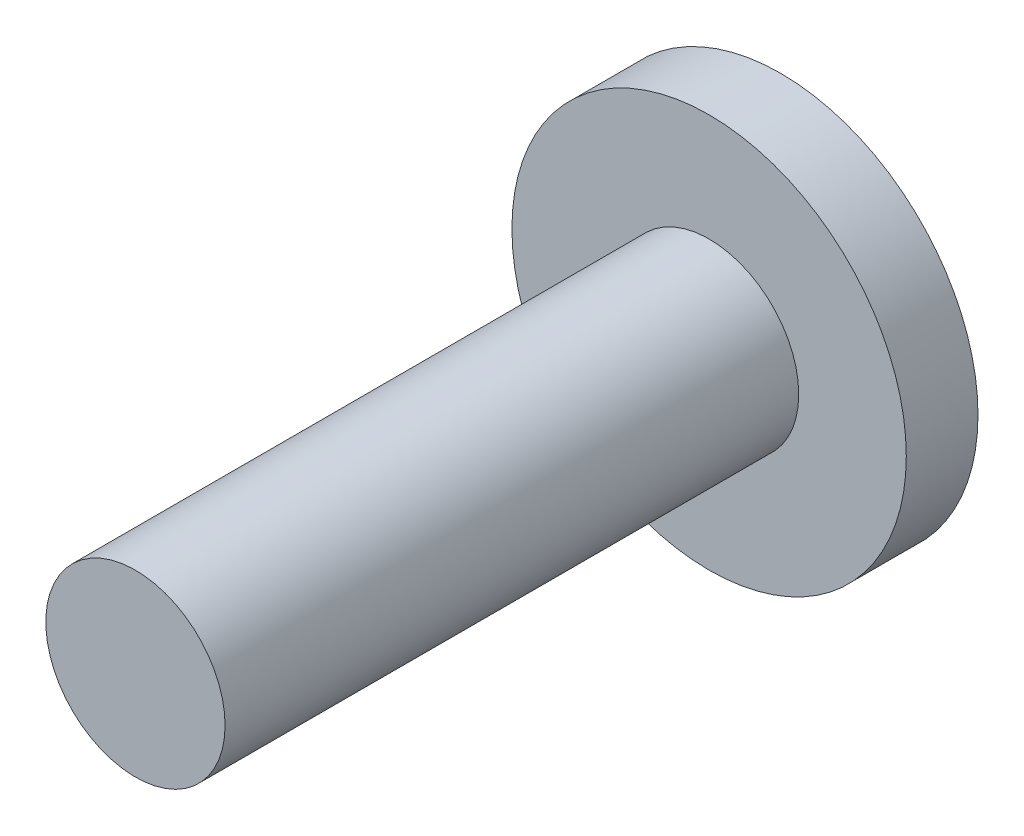
ISO-10303-21;
HEADER;
FILE_DESCRIPTION(('STEP AP214'),'2;1');
FILE_NAME('part.step','',(''),(''),'','','');
FILE_SCHEMA(('AUTOMOTIVE_DESIGN { 1 0 10303 214 1 1 1 1 }'));
ENDSEC;
DATA;
#1=APPLICATION_CONTEXT('core data for automotive mechanical design processes');
#2=APPLICATION_PROTOCOL_DEFINITION('international standard','automotive_design',2000,#1);
#3=PRODUCT_CONTEXT('',#1,'mechanical');
#4=PRODUCT('Part','Part','',(#3));
#5=PRODUCT_RELATED_PRODUCT_CATEGORY('part','',(#4));
#6=PRODUCT_DEFINITION_FORMATION('','',#4);
#7=PRODUCT_DEFINITION_CONTEXT('part definition',#1,'design');
#8=PRODUCT_DEFINITION('design','',#6,#7);
#9=PRODUCT_DEFINITION_SHAPE('','',#8);
#10=(LENGTH_UNIT() NAMED_UNIT(*) SI_UNIT(.MILLI.,.METRE.));
#11=(NAMED_UNIT(*) PLANE_ANGLE_UNIT() SI_UNIT($,.RADIAN.));
#12=(NAMED_UNIT(*) SI_UNIT($,.STERADIAN.) SOLID_ANGLE_UNIT());
#13=UNCERTAINTY_MEASURE_WITH_UNIT(LENGTH_MEASURE(1.E-05),#10,'distance_accuracy_value','');
#14=(GEOMETRIC_REPRESENTATION_CONTEXT(3) GLOBAL_UNCERTAINTY_ASSIGNED_CONTEXT((#13)) GLOBAL_UNIT_ASSIGNED_CONTEXT((#10,
#11,#12)) REPRESENTATION_CONTEXT('',''));
#15=CARTESIAN_POINT('',(0.,0.,0.));
#16=DIRECTION('',(0.,0.,1.));
#17=DIRECTION('',(1.,0.,0.));
#18=AXIS2_PLACEMENT_3D('',#15,#16,#17);
#19=CARTESIAN_POINT('',(0.,0.,1.));
#20=DIRECTION('',(0.,0.,-1.));
#21=DIRECTION('',(-1.,0.,0.));
#22=AXIS2_PLACEMENT_3D('',#19,#20,#21);
#23=CYLINDRICAL_SURFACE('',#22,2.75);
#24=CARTESIAN_POINT('',(0.,0.,1.));
#25=DIRECTION('',(0.,0.,1.));
#26=DIRECTION('',(1.,0.,0.));
#27=AXIS2_PLACEMENT_3D('',#24,#25,#26);
#28=CIRCLE('',#27,2.75);
#29=CARTESIAN_POINT('',(2.75,0.,1.));
#30=VERTEX_POINT('',#29);
#31=EDGE_CURVE('E25',#30,#30,#28,.T.);
#32=ORIENTED_EDGE('',*,*,#31,.F.);
#33=EDGE_LOOP('',(#32));
#34=FACE_BOUND('',#33,.T.);
#35=CARTESIAN_POINT('',(0.,0.,0.));
#36=DIRECTION('',(0.,0.,1.));
#37=DIRECTION('',(1.,0.,0.));
#38=AXIS2_PLACEMENT_3D('',#35,#36,#37);
#39=CIRCLE('',#38,2.75);
#40=CARTESIAN_POINT('',(2.75,0.,0.));
#41=VERTEX_POINT('',#40);
#42=EDGE_CURVE('E20',#41,#41,#39,.T.);
#43=ORIENTED_EDGE('',*,*,#42,.T.);
#44=EDGE_LOOP('',(#43));
#45=FACE_BOUND('',#44,.T.);
#46=ADVANCED_FACE('F17',(#34,#45),#23,.T.);
#47=CARTESIAN_POINT('',(0.,0.,1.));
#48=DIRECTION('',(0.,0.,1.));
#49=DIRECTION('',(1.,0.,0.));
#50=AXIS2_PLACEMENT_3D('',#47,#48,#49);
#51=PLANE('',#50);
#52=CARTESIAN_POINT('',(0.,0.,1.));
#53=DIRECTION('',(0.,0.,1.));
#54=DIRECTION('',(1.,0.,0.));
#55=AXIS2_PLACEMENT_3D('',#52,#53,#54);
#56=CIRCLE('',#55,1.25);
#57=CARTESIAN_POINT('',(1.25,0.,1.));
#58=VERTEX_POINT('',#57);
#59=EDGE_CURVE('E11',#58,#58,#56,.T.);
#60=ORIENTED_EDGE('',*,*,#59,.F.);
#61=EDGE_LOOP('',(#60));
#62=FACE_BOUND('',#61,.T.);
#63=ORIENTED_EDGE('',*,*,#31,.T.);
#64=EDGE_LOOP('',(#63));
#65=FACE_BOUND('',#64,.T.);
#66=ADVANCED_FACE('F203',(#62,#65),#51,.T.);
#67=CARTESIAN_POINT('',(0.,0.,0.));
#68=DIRECTION('',(0.,0.,1.));
#69=DIRECTION('',(1.,0.,0.));
#70=AXIS2_PLACEMENT_3D('',#67,#68,#69);
#71=PLANE('',#70);
#72=DIRECTION('',(1.,0.,0.));
#73=VECTOR('',#72,1.);
#74=CARTESIAN_POINT('',(0.25,0.25,0.));
#75=LINE('',#74,#73);
#76=CARTESIAN_POINT('',(0.25,0.25,0.));
#77=VERTEX_POINT('',#76);
#78=CARTESIAN_POINT('',(2.25,0.25,0.));
#79=VERTEX_POINT('',#78);
#80=EDGE_CURVE('E143',#77,#79,#75,.T.);
#81=ORIENTED_EDGE('',*,*,#80,.F.);
#82=DIRECTION('',(0.,-1.,0.));
#83=VECTOR('',#82,1.);
#84=CARTESIAN_POINT('',(0.25,0.25,0.));
#85=LINE('',#84,#83);
#86=CARTESIAN_POINT('',(0.25,2.25,0.));
#87=VERTEX_POINT('',#86);
#88=EDGE_CURVE('E33',#87,#77,#85,.T.);
#89=ORIENTED_EDGE('',*,*,#88,.F.);
#90=DIRECTION('',(1.,0.,0.));
#91=VECTOR('',#90,1.);
#92=CARTESIAN_POINT('',(-0.25,2.25,0.));
#93=LINE('',#92,#91);
#94=CARTESIAN_POINT('',(-0.25,2.25,0.));
#95=VERTEX_POINT('',#94);
#96=EDGE_CURVE('E170',#95,#87,#93,.T.);
#97=ORIENTED_EDGE('',*,*,#96,.F.);
#98=DIRECTION('',(0.,1.,0.));
#99=VECTOR('',#98,1.);
#100=CARTESIAN_POINT('',(-0.25,0.25,0.));
#101=LINE('',#100,#99);
#102=CARTESIAN_POINT('',(-0.25,0.25,0.));
#103=VERTEX_POINT('',#102);
#104=EDGE_CURVE('E168',#103,#95,#101,.T.);
#105=ORIENTED_EDGE('',*,*,#104,.F.);
#106=DIRECTION('',(1.,0.,0.));
#107=VECTOR('',#106,1.);
#108=CARTESIAN_POINT('',(-2.25,0.25,0.));
#109=LINE('',#108,#107);
#110=CARTESIAN_POINT('',(-2.25,0.25,0.));
#111=VERTEX_POINT('',#110);
#112=EDGE_CURVE('E117',#111,#103,#109,.T.);
#113=ORIENTED_EDGE('',*,*,#112,.F.);
#114=DIRECTION('',(0.,1.,0.));
#115=VECTOR('',#114,1.);
#116=CARTESIAN_POINT('',(-2.25,0.25,0.));
#117=LINE('',#116,#115);
#118=CARTESIAN_POINT('',(-2.25,-0.25,0.));
#119=VERTEX_POINT('',#118);
#120=EDGE_CURVE('E164',#119,#111,#117,.T.);
#121=ORIENTED_EDGE('',*,*,#120,.F.);
#122=DIRECTION('',(-1.,0.,0.));
#123=VECTOR('',#122,1.);
#124=CARTESIAN_POINT('',(-2.25,-0.25,0.));
#125=LINE('',#124,#123);
#126=CARTESIAN_POINT('',(-0.25,-0.25,0.));
#127=VERTEX_POINT('',#126);
#128=EDGE_CURVE('E161',#127,#119,#125,.T.);
#129=ORIENTED_EDGE('',*,*,#128,.F.);
#130=DIRECTION('',(0.,1.,0.));
#131=VECTOR('',#130,1.);
#132=CARTESIAN_POINT('',(-0.25,-2.25,0.));
#133=LINE('',#132,#131);
#134=CARTESIAN_POINT('',(-0.25,-2.25,0.));
#135=VERTEX_POINT('',#134);
#136=EDGE_CURVE('E158',#135,#127,#133,.T.);
#137=ORIENTED_EDGE('',*,*,#136,.F.);
#138=DIRECTION('',(-1.,0.,0.));
#139=VECTOR('',#138,1.);
#140=CARTESIAN_POINT('',(-0.25,-2.25,0.));
#141=LINE('',#140,#139);
#142=CARTESIAN_POINT('',(0.25,-2.25,0.));
#143=VERTEX_POINT('',#142);
#144=EDGE_CURVE('E155',#143,#135,#141,.T.);
#145=ORIENTED_EDGE('',*,*,#144,.F.);
#146=DIRECTION('',(0.,-1.,0.));
#147=VECTOR('',#146,1.);
#148=CARTESIAN_POINT('',(0.25,-2.25,0.));
#149=LINE('',#148,#147);
#150=CARTESIAN_POINT('',(0.25,-0.25,0.));
#151=VERTEX_POINT('',#150);
#152=EDGE_CURVE('E152',#151,#143,#149,.T.);
#153=ORIENTED_EDGE('',*,*,#152,.F.);
#154=DIRECTION('',(-1.,0.,0.));
#155=VECTOR('',#154,1.);
#156=CARTESIAN_POINT('',(0.25,-0.25,0.));
#157=LINE('',#156,#155);
#158=CARTESIAN_POINT('',(2.25,-0.25,0.));
#159=VERTEX_POINT('',#158);
#160=EDGE_CURVE('E149',#159,#151,#157,.T.);
#161=ORIENTED_EDGE('',*,*,#160,.F.);
#162=DIRECTION('',(0.,-1.,0.));
#163=VECTOR('',#162,1.);
#164=CARTESIAN_POINT('',(2.25,0.25,0.));
#165=LINE('',#164,#163);
#166=EDGE_CURVE('E146',#79,#159,#165,.T.);
#167=ORIENTED_EDGE('',*,*,#166,.F.);
#168=EDGE_LOOP('',(#81,#89,#97,#105,#113,#121,#129,#137,#145,#153,#161,#167));
#169=FACE_BOUND('',#168,.T.);
#170=ORIENTED_EDGE('',*,*,#42,.F.);
#171=EDGE_LOOP('',(#170));
#172=FACE_BOUND('',#171,.T.);
#173=ADVANCED_FACE('F200',(#169,#172),#71,.F.);
#174=CARTESIAN_POINT('',(0.,0.,9.));
#175=DIRECTION('',(0.,0.,-1.));
#176=DIRECTION('',(-1.,0.,0.));
#177=AXIS2_PLACEMENT_3D('',#174,#175,#176);
#178=CYLINDRICAL_SURFACE('',#177,1.25);
#179=CARTESIAN_POINT('',(0.,0.,9.));
#180=DIRECTION('',(0.,0.,1.));
#181=DIRECTION('',(1.,0.,0.));
#182=AXIS2_PLACEMENT_3D('',#179,#180,#181);
#183=CIRCLE('',#182,1.25);
#184=CARTESIAN_POINT('',(1.25,0.,9.));
#185=VERTEX_POINT('',#184);
#186=EDGE_CURVE('E174',#185,#185,#183,.T.);
#187=ORIENTED_EDGE('',*,*,#186,.F.);
#188=EDGE_LOOP('',(#187));
#189=FACE_BOUND('',#188,.T.);
#190=ORIENTED_EDGE('',*,*,#59,.T.);
#191=EDGE_LOOP('',(#190));
#192=FACE_BOUND('',#191,.T.);
#193=ADVANCED_FACE('F202',(#189,#192),#178,.T.);
#194=CARTESIAN_POINT('',(0.,0.,9.));
#195=DIRECTION('',(0.,0.,1.));
#196=DIRECTION('',(1.,0.,0.));
#197=AXIS2_PLACEMENT_3D('',#194,#195,#196);
#198=PLANE('',#197);
#199=ORIENTED_EDGE('',*,*,#186,.T.);
#200=EDGE_LOOP('',(#199));
#201=FACE_BOUND('',#200,.T.);
#202=ADVANCED_FACE('F211',(#201),#198,.T.);
#203=CARTESIAN_POINT('',(0.25,0.25,0.5));
#204=DIRECTION('',(1.,0.,0.));
#205=DIRECTION('',(0.,0.,-1.));
#206=AXIS2_PLACEMENT_3D('',#203,#204,#205);
#207=PLANE('',#206);
#208=ORIENTED_EDGE('',*,*,#88,.T.);
#209=DIRECTION('',(0.,0.,-1.));
#210=VECTOR('',#209,1.);
#211=CARTESIAN_POINT('',(0.25,0.25,0.5));
#212=LINE('',#211,#210);
#213=CARTESIAN_POINT('',(0.25,0.25,0.5));
#214=VERTEX_POINT('',#213);
#215=EDGE_CURVE('E81',#214,#77,#212,.T.);
#216=ORIENTED_EDGE('',*,*,#215,.F.);
#217=DIRECTION('',(0.,-1.,0.));
#218=VECTOR('',#217,1.);
#219=CARTESIAN_POINT('',(0.25,0.25,0.5));
#220=LINE('',#219,#218);
#221=CARTESIAN_POINT('',(0.25,2.25,0.5));
#222=VERTEX_POINT('',#221);
#223=EDGE_CURVE('E172',#222,#214,#220,.T.);
#224=ORIENTED_EDGE('',*,*,#223,.F.);
#225=DIRECTION('',(0.,0.,-1.));
#226=VECTOR('',#225,1.);
#227=CARTESIAN_POINT('',(0.25,2.25,0.5));
#228=LINE('',#227,#226);
#229=EDGE_CURVE('E41',#222,#87,#228,.T.);
#230=ORIENTED_EDGE('',*,*,#229,.T.);
#231=EDGE_LOOP('',(#208,#216,#224,#230));
#232=FACE_BOUND('',#231,.T.);
#233=ADVANCED_FACE('F249',(#232),#207,.F.);
#234=CARTESIAN_POINT('',(-0.25,2.25,0.5));
#235=DIRECTION('',(0.,1.,0.));
#236=DIRECTION('',(0.,0.,1.));
#237=AXIS2_PLACEMENT_3D('',#234,#235,#236);
#238=PLANE('',#237);
#239=ORIENTED_EDGE('',*,*,#96,.T.);
#240=ORIENTED_EDGE('',*,*,#229,.F.);
#241=DIRECTION('',(1.,0.,0.));
#242=VECTOR('',#241,1.);
#243=CARTESIAN_POINT('',(-0.25,2.25,0.5));
#244=LINE('',#243,#242);
#245=CARTESIAN_POINT('',(-0.25,2.25,0.5));
#246=VERTEX_POINT('',#245);
#247=EDGE_CURVE('E129',#246,#222,#244,.T.);
#248=ORIENTED_EDGE('',*,*,#247,.F.);
#249=DIRECTION('',(0.,0.,-1.));
#250=VECTOR('',#249,1.);
#251=CARTESIAN_POINT('',(-0.25,2.25,0.5));
#252=LINE('',#251,#250);
#253=EDGE_CURVE('E121',#246,#95,#252,.T.);
#254=ORIENTED_EDGE('',*,*,#253,.T.);
#255=EDGE_LOOP('',(#239,#240,#248,#254));
#256=FACE_BOUND('',#255,.T.);
#257=ADVANCED_FACE('F259',(#256),#238,.F.);
#258=CARTESIAN_POINT('',(-0.25,0.25,0.5));
#259=DIRECTION('',(-1.,0.,0.));
#260=DIRECTION('',(0.,-1.,0.));
#261=AXIS2_PLACEMENT_3D('',#258,#259,#260);
#262=PLANE('',#261);
#263=ORIENTED_EDGE('',*,*,#104,.T.);
#264=ORIENTED_EDGE('',*,*,#253,.F.);
#265=DIRECTION('',(0.,1.,0.));
#266=VECTOR('',#265,1.);
#267=CARTESIAN_POINT('',(-0.25,0.25,0.5));
#268=LINE('',#267,#266);
#269=CARTESIAN_POINT('',(-0.25,0.25,0.5));
#270=VERTEX_POINT('',#269);
#271=EDGE_CURVE('E125',#270,#246,#268,.T.);
#272=ORIENTED_EDGE('',*,*,#271,.F.);
#273=DIRECTION('',(0.,0.,-1.));
#274=VECTOR('',#273,1.);
#275=CARTESIAN_POINT('',(-0.25,0.25,0.5));
#276=LINE('',#275,#274);
#277=EDGE_CURVE('E110',#270,#103,#276,.T.);
#278=ORIENTED_EDGE('',*,*,#277,.T.);
#279=EDGE_LOOP('',(#263,#264,#272,#278));
#280=FACE_BOUND('',#279,.T.);
#281=ADVANCED_FACE('F126',(#280),#262,.F.);
#282=CARTESIAN_POINT('',(-2.25,0.25,0.5));
#283=DIRECTION('',(0.,1.,0.));
#284=DIRECTION('',(-1.,0.,0.));
#285=AXIS2_PLACEMENT_3D('',#282,#283,#284);
#286=PLANE('',#285);
#287=ORIENTED_EDGE('',*,*,#112,.T.);
#288=ORIENTED_EDGE('',*,*,#277,.F.);
#289=DIRECTION('',(1.,0.,0.));
#290=VECTOR('',#289,1.);
#291=CARTESIAN_POINT('',(-2.25,0.25,0.5));
#292=LINE('',#291,#290);
#293=CARTESIAN_POINT('',(-2.25,0.25,0.5));
#294=VERTEX_POINT('',#293);
#295=EDGE_CURVE('E114',#294,#270,#292,.T.);
#296=ORIENTED_EDGE('',*,*,#295,.F.);
#297=DIRECTION('',(0.,0.,-1.));
#298=VECTOR('',#297,1.);
#299=CARTESIAN_POINT('',(-2.25,0.25,0.5));
#300=LINE('',#299,#298);
#301=EDGE_CURVE('E122',#294,#111,#300,.T.);
#302=ORIENTED_EDGE('',*,*,#301,.T.);
#303=EDGE_LOOP('',(#287,#288,#296,#302));
#304=FACE_BOUND('',#303,.T.);
#305=ADVANCED_FACE('F112',(#304),#286,.F.);
#306=CARTESIAN_POINT('',(-2.25,0.25,0.5));
#307=DIRECTION('',(-1.,0.,0.));
#308=DIRECTION('',(0.,0.,1.));
#309=AXIS2_PLACEMENT_3D('',#306,#307,#308);
#310=PLANE('',#309);
#311=ORIENTED_EDGE('',*,*,#120,.T.);
#312=ORIENTED_EDGE('',*,*,#301,.F.);
#313=DIRECTION('',(0.,1.,0.));
#314=VECTOR('',#313,1.);
#315=CARTESIAN_POINT('',(-2.25,0.25,0.5));
#316=LINE('',#315,#314);
#317=CARTESIAN_POINT('',(-2.25,-0.25,0.5));
#318=VERTEX_POINT('',#317);
#319=EDGE_CURVE('E135',#318,#294,#316,.T.);
#320=ORIENTED_EDGE('',*,*,#319,.F.);
#321=DIRECTION('',(0.,0.,-1.));
#322=VECTOR('',#321,1.);
#323=CARTESIAN_POINT('',(-2.25,-0.25,0.5));
#324=LINE('',#323,#322);
#325=EDGE_CURVE('E177',#318,#119,#324,.T.);
#326=ORIENTED_EDGE('',*,*,#325,.T.);
#327=EDGE_LOOP('',(#311,#312,#320,#326));
#328=FACE_BOUND('',#327,.T.);
#329=ADVANCED_FACE('F284',(#328),#310,.F.);
#330=CARTESIAN_POINT('',(-2.25,-0.25,0.5));
#331=DIRECTION('',(0.,-1.,0.));
#332=DIRECTION('',(1.,0.,0.));
#333=AXIS2_PLACEMENT_3D('',#330,#331,#332);
#334=PLANE('',#333);
#335=ORIENTED_EDGE('',*,*,#128,.T.);
#336=ORIENTED_EDGE('',*,*,#325,.F.);
#337=DIRECTION('',(-1.,0.,0.));
#338=VECTOR('',#337,1.);
#339=CARTESIAN_POINT('',(-2.25,-0.25,0.5));
#340=LINE('',#339,#338);
#341=CARTESIAN_POINT('',(-0.25,-0.25,0.5));
#342=VERTEX_POINT('',#341);
#343=EDGE_CURVE('E137',#342,#318,#340,.T.);
#344=ORIENTED_EDGE('',*,*,#343,.F.);
#345=DIRECTION('',(0.,0.,-1.));
#346=VECTOR('',#345,1.);
#347=CARTESIAN_POINT('',(-0.25,-0.25,0.5));
#348=LINE('',#347,#346);
#349=EDGE_CURVE('E179',#342,#127,#348,.T.);
#350=ORIENTED_EDGE('',*,*,#349,.T.);
#351=EDGE_LOOP('',(#335,#336,#344,#350));
#352=FACE_BOUND('',#351,.T.);
#353=ADVANCED_FACE('F293',(#352),#334,.F.);
#354=CARTESIAN_POINT('',(-0.25,-2.25,0.5));
#355=DIRECTION('',(-1.,0.,0.));
#356=DIRECTION('',(0.,-1.,0.));
#357=AXIS2_PLACEMENT_3D('',#354,#355,#356);
#358=PLANE('',#357);
#359=ORIENTED_EDGE('',*,*,#136,.T.);
#360=ORIENTED_EDGE('',*,*,#349,.F.);
#361=DIRECTION('',(0.,1.,0.));
#362=VECTOR('',#361,1.);
#363=CARTESIAN_POINT('',(-0.25,-2.25,0.5));
#364=LINE('',#363,#362);
#365=CARTESIAN_POINT('',(-0.25,-2.25,0.5));
#366=VERTEX_POINT('',#365);
#367=EDGE_CURVE('E399',#366,#342,#364,.T.);
#368=ORIENTED_EDGE('',*,*,#367,.F.);
#369=DIRECTION('',(0.,0.,-1.));
#370=VECTOR('',#369,1.);
#371=CARTESIAN_POINT('',(-0.25,-2.25,0.5));
#372=LINE('',#371,#370);
#373=EDGE_CURVE('E181',#366,#135,#372,.T.);
#374=ORIENTED_EDGE('',*,*,#373,.T.);
#375=EDGE_LOOP('',(#359,#360,#368,#374));
#376=FACE_BOUND('',#375,.T.);
#377=ADVANCED_FACE('F303',(#376),#358,.F.);
#378=CARTESIAN_POINT('',(-0.25,-2.25,0.5));
#379=DIRECTION('',(0.,-1.,0.));
#380=DIRECTION('',(0.,0.,-1.));
#381=AXIS2_PLACEMENT_3D('',#378,#379,#380);
#382=PLANE('',#381);
#383=ORIENTED_EDGE('',*,*,#144,.T.);
#384=ORIENTED_EDGE('',*,*,#373,.F.);
#385=DIRECTION('',(-1.,0.,0.));
#386=VECTOR('',#385,1.);
#387=CARTESIAN_POINT('',(-0.25,-2.25,0.5));
#388=LINE('',#387,#386);
#389=CARTESIAN_POINT('',(0.25,-2.25,0.5));
#390=VERTEX_POINT('',#389);
#391=EDGE_CURVE('E396',#390,#366,#388,.T.);
#392=ORIENTED_EDGE('',*,*,#391,.F.);
#393=DIRECTION('',(0.,0.,-1.));
#394=VECTOR('',#393,1.);
#395=CARTESIAN_POINT('',(0.25,-2.25,0.5));
#396=LINE('',#395,#394);
#397=EDGE_CURVE('E183',#390,#143,#396,.T.);
#398=ORIENTED_EDGE('',*,*,#397,.T.);
#399=EDGE_LOOP('',(#383,#384,#392,#398));
#400=FACE_BOUND('',#399,.T.);
#401=ADVANCED_FACE('F313',(#400),#382,.F.);
#402=CARTESIAN_POINT('',(0.25,-2.25,0.5));
#403=DIRECTION('',(1.,0.,0.));
#404=DIRECTION('',(0.,1.,0.));
#405=AXIS2_PLACEMENT_3D('',#402,#403,#404);
#406=PLANE('',#405);
#407=ORIENTED_EDGE('',*,*,#152,.T.);
#408=ORIENTED_EDGE('',*,*,#397,.F.);
#409=DIRECTION('',(0.,-1.,0.));
#410=VECTOR('',#409,1.);
#411=CARTESIAN_POINT('',(0.25,-2.25,0.5));
#412=LINE('',#411,#410);
#413=CARTESIAN_POINT('',(0.25,-0.25,0.5));
#414=VERTEX_POINT('',#413);
#415=EDGE_CURVE('E393',#414,#390,#412,.T.);
#416=ORIENTED_EDGE('',*,*,#415,.F.);
#417=DIRECTION('',(0.,0.,-1.));
#418=VECTOR('',#417,1.);
#419=CARTESIAN_POINT('',(0.25,-0.25,0.5));
#420=LINE('',#419,#418);
#421=EDGE_CURVE('E185',#414,#151,#420,.T.);
#422=ORIENTED_EDGE('',*,*,#421,.T.);
#423=EDGE_LOOP('',(#407,#408,#416,#422));
#424=FACE_BOUND('',#423,.T.);
#425=ADVANCED_FACE('F323',(#424),#406,.F.);
#426=CARTESIAN_POINT('',(0.25,-0.25,0.5));
#427=DIRECTION('',(0.,-1.,0.));
#428=DIRECTION('',(1.,0.,0.));
#429=AXIS2_PLACEMENT_3D('',#426,#427,#428);
#430=PLANE('',#429);
#431=ORIENTED_EDGE('',*,*,#160,.T.);
#432=ORIENTED_EDGE('',*,*,#421,.F.);
#433=DIRECTION('',(-1.,0.,0.));
#434=VECTOR('',#433,1.);
#435=CARTESIAN_POINT('',(0.25,-0.25,0.5));
#436=LINE('',#435,#434);
#437=CARTESIAN_POINT('',(2.25,-0.25,0.5));
#438=VERTEX_POINT('',#437);
#439=EDGE_CURVE('E386',#438,#414,#436,.T.);
#440=ORIENTED_EDGE('',*,*,#439,.F.);
#441=DIRECTION('',(0.,0.,-1.));
#442=VECTOR('',#441,1.);
#443=CARTESIAN_POINT('',(2.25,-0.25,0.5));
#444=LINE('',#443,#442);
#445=EDGE_CURVE('E187',#438,#159,#444,.T.);
#446=ORIENTED_EDGE('',*,*,#445,.T.);
#447=EDGE_LOOP('',(#431,#432,#440,#446));
#448=FACE_BOUND('',#447,.T.);
#449=ADVANCED_FACE('F333',(#448),#430,.F.);
#450=CARTESIAN_POINT('',(2.25,0.25,0.5));
#451=DIRECTION('',(1.,0.,0.));
#452=DIRECTION('',(0.,0.,-1.));
#453=AXIS2_PLACEMENT_3D('',#450,#451,#452);
#454=PLANE('',#453);
#455=ORIENTED_EDGE('',*,*,#166,.T.);
#456=ORIENTED_EDGE('',*,*,#445,.F.);
#457=DIRECTION('',(0.,-1.,0.));
#458=VECTOR('',#457,1.);
#459=CARTESIAN_POINT('',(2.25,0.25,0.5));
#460=LINE('',#459,#458);
#461=CARTESIAN_POINT('',(2.25,0.25,0.5));
#462=VERTEX_POINT('',#461);
#463=EDGE_CURVE('E383',#462,#438,#460,.T.);
#464=ORIENTED_EDGE('',*,*,#463,.F.);
#465=DIRECTION('',(0.,0.,-1.));
#466=VECTOR('',#465,1.);
#467=CARTESIAN_POINT('',(2.25,0.25,0.5));
#468=LINE('',#467,#466);
#469=EDGE_CURVE('E189',#462,#79,#468,.T.);
#470=ORIENTED_EDGE('',*,*,#469,.T.);
#471=EDGE_LOOP('',(#455,#456,#464,#470));
#472=FACE_BOUND('',#471,.T.);
#473=ADVANCED_FACE('F343',(#472),#454,.F.);
#474=CARTESIAN_POINT('',(0.25,0.25,0.5));
#475=DIRECTION('',(0.,1.,0.));
#476=DIRECTION('',(-1.,0.,0.));
#477=AXIS2_PLACEMENT_3D('',#474,#475,#476);
#478=PLANE('',#477);
#479=ORIENTED_EDGE('',*,*,#80,.T.);
#480=ORIENTED_EDGE('',*,*,#469,.F.);
#481=DIRECTION('',(1.,0.,0.));
#482=VECTOR('',#481,1.);
#483=CARTESIAN_POINT('',(0.25,0.25,0.5));
#484=LINE('',#483,#482);
#485=EDGE_CURVE('E387',#214,#462,#484,.T.);
#486=ORIENTED_EDGE('',*,*,#485,.F.);
#487=ORIENTED_EDGE('',*,*,#215,.T.);
#488=EDGE_LOOP('',(#479,#480,#486,#487));
#489=FACE_BOUND('',#488,.T.);
#490=ADVANCED_FACE('F353',(#489),#478,.F.);
#491=CARTESIAN_POINT('',(0.,0.,0.5));
#492=DIRECTION('',(0.,0.,-1.));
#493=DIRECTION('',(-1.,0.,0.));
#494=AXIS2_PLACEMENT_3D('',#491,#492,#493);
#495=PLANE('',#494);
#496=ORIENTED_EDGE('',*,*,#223,.T.);
#497=ORIENTED_EDGE('',*,*,#485,.T.);
#498=ORIENTED_EDGE('',*,*,#463,.T.);
#499=ORIENTED_EDGE('',*,*,#439,.T.);
#500=ORIENTED_EDGE('',*,*,#415,.T.);
#501=ORIENTED_EDGE('',*,*,#391,.T.);
#502=ORIENTED_EDGE('',*,*,#367,.T.);
#503=ORIENTED_EDGE('',*,*,#343,.T.);
#504=ORIENTED_EDGE('',*,*,#319,.T.);
#505=ORIENTED_EDGE('',*,*,#295,.T.);
#506=ORIENTED_EDGE('',*,*,#271,.T.);
#507=ORIENTED_EDGE('',*,*,#247,.T.);
#508=EDGE_LOOP('',(#496,#497,#498,#499,#500,#501,#502,#503,#504,#505,#506,#507));
#509=FACE_BOUND('',#508,.T.);
#510=ADVANCED_FACE('F132',(#509),#495,.T.);
#511=CLOSED_SHELL('',(#46,#66,#173,#193,#202,#233,#257,#281,#305,#329,#353,#377,#401,#425,#449,
#473,#490,#510));
#512=MANIFOLD_SOLID_BREP('B1',#511);
#513=ADVANCED_BREP_SHAPE_REPRESENTATION('',(#18,#512),#14);
#514=SHAPE_DEFINITION_REPRESENTATION(#9,#513);
ENDSEC;
END-ISO-10303-21;
